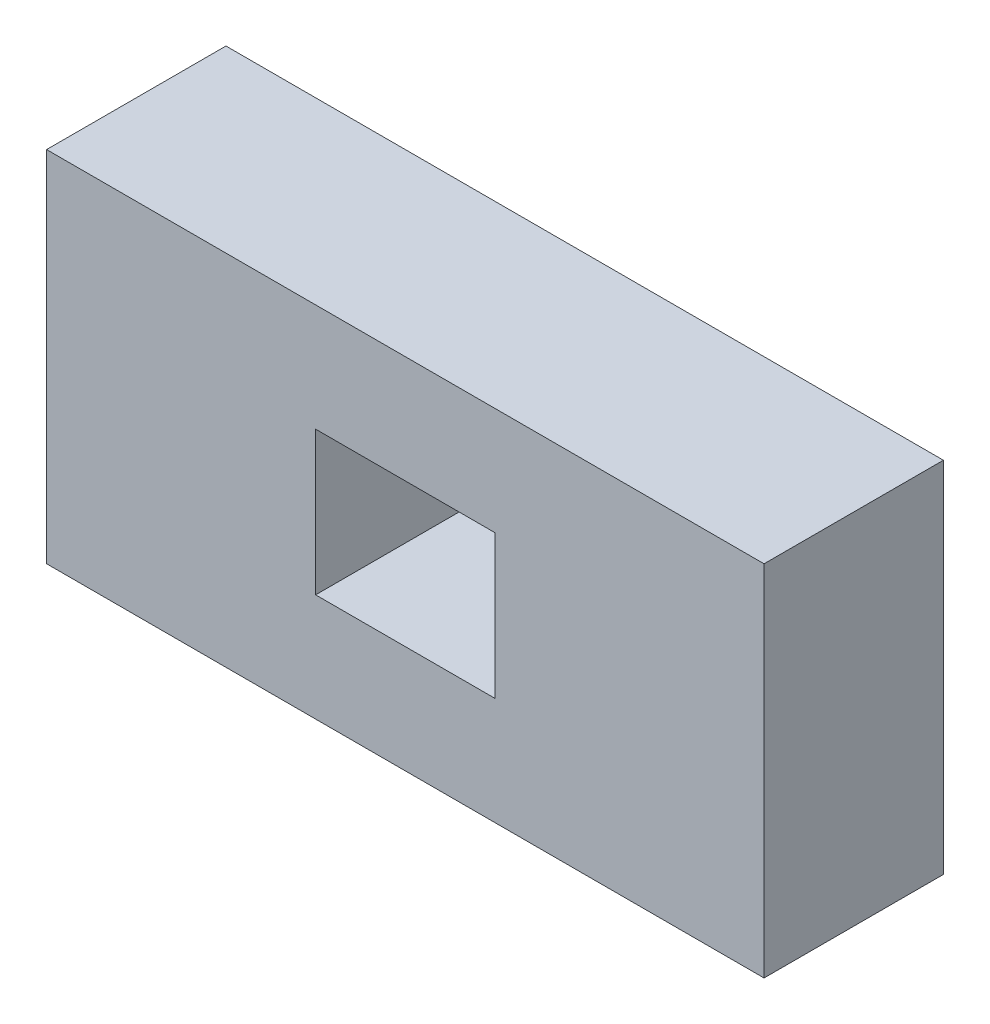
ISO-10303-21;
HEADER;
FILE_DESCRIPTION(('STEP AP214'),'2;1');
FILE_NAME('part.step','',(''),(''),'','','');
FILE_SCHEMA(('AUTOMOTIVE_DESIGN { 1 0 10303 214 1 1 1 1 }'));
ENDSEC;
DATA;
#1=APPLICATION_CONTEXT('core data for automotive mechanical design processes');
#2=APPLICATION_PROTOCOL_DEFINITION('international standard','automotive_design',2000,#1);
#3=PRODUCT_CONTEXT('',#1,'mechanical');
#4=PRODUCT('Part','Part','',(#3));
#5=PRODUCT_RELATED_PRODUCT_CATEGORY('part','',(#4));
#6=PRODUCT_DEFINITION_FORMATION('','',#4);
#7=PRODUCT_DEFINITION_CONTEXT('part definition',#1,'design');
#8=PRODUCT_DEFINITION('design','',#6,#7);
#9=PRODUCT_DEFINITION_SHAPE('','',#8);
#10=(LENGTH_UNIT() NAMED_UNIT(*) SI_UNIT(.MILLI.,.METRE.));
#11=(NAMED_UNIT(*) PLANE_ANGLE_UNIT() SI_UNIT($,.RADIAN.));
#12=(NAMED_UNIT(*) SI_UNIT($,.STERADIAN.) SOLID_ANGLE_UNIT());
#13=UNCERTAINTY_MEASURE_WITH_UNIT(LENGTH_MEASURE(1.E-05),#10,'distance_accuracy_value','');
#14=(GEOMETRIC_REPRESENTATION_CONTEXT(3) GLOBAL_UNCERTAINTY_ASSIGNED_CONTEXT((#13)) GLOBAL_UNIT_ASSIGNED_CONTEXT((#10,
#11,#12)) REPRESENTATION_CONTEXT('',''));
#15=CARTESIAN_POINT('',(0.,0.,0.));
#16=DIRECTION('',(0.,0.,1.));
#17=DIRECTION('',(1.,0.,0.));
#18=AXIS2_PLACEMENT_3D('',#15,#16,#17);
#19=CARTESIAN_POINT('',(0.,0.,10.));
#20=DIRECTION('',(1.,0.,0.));
#21=DIRECTION('',(0.,0.,-1.));
#22=AXIS2_PLACEMENT_3D('',#19,#20,#21);
#23=PLANE('',#22);
#24=DIRECTION('',(0.,-1.,0.));
#25=VECTOR('',#24,1.);
#26=CARTESIAN_POINT('',(0.,0.,0.));
#27=LINE('',#26,#25);
#28=CARTESIAN_POINT('',(0.,20.,0.));
#29=VERTEX_POINT('',#28);
#30=CARTESIAN_POINT('',(0.,0.,0.));
#31=VERTEX_POINT('',#30);
#32=EDGE_CURVE('E142',#29,#31,#27,.T.);
#33=ORIENTED_EDGE('',*,*,#32,.T.);
#34=DIRECTION('',(0.,0.,-1.));
#35=VECTOR('',#34,1.);
#36=CARTESIAN_POINT('',(0.,0.,10.));
#37=LINE('',#36,#35);
#38=CARTESIAN_POINT('',(0.,0.,10.));
#39=VERTEX_POINT('',#38);
#40=EDGE_CURVE('E11',#39,#31,#37,.T.);
#41=ORIENTED_EDGE('',*,*,#40,.F.);
#42=DIRECTION('',(0.,-1.,0.));
#43=VECTOR('',#42,1.);
#44=CARTESIAN_POINT('',(0.,0.,10.));
#45=LINE('',#44,#43);
#46=CARTESIAN_POINT('',(0.,20.,10.));
#47=VERTEX_POINT('',#46);
#48=EDGE_CURVE('E148',#47,#39,#45,.T.);
#49=ORIENTED_EDGE('',*,*,#48,.F.);
#50=DIRECTION('',(0.,0.,-1.));
#51=VECTOR('',#50,1.);
#52=CARTESIAN_POINT('',(0.,20.,10.));
#53=LINE('',#52,#51);
#54=EDGE_CURVE('E156',#47,#29,#53,.T.);
#55=ORIENTED_EDGE('',*,*,#54,.T.);
#56=EDGE_LOOP('',(#33,#41,#49,#55));
#57=FACE_BOUND('',#56,.T.);
#58=ADVANCED_FACE('F44',(#57),#23,.F.);
#59=CARTESIAN_POINT('',(0.,0.,10.));
#60=DIRECTION('',(0.,1.,0.));
#61=DIRECTION('',(0.,0.,1.));
#62=AXIS2_PLACEMENT_3D('',#59,#60,#61);
#63=PLANE('',#62);
#64=DIRECTION('',(1.,0.,0.));
#65=VECTOR('',#64,1.);
#66=CARTESIAN_POINT('',(0.,0.,0.));
#67=LINE('',#66,#65);
#68=CARTESIAN_POINT('',(40.,0.,0.));
#69=VERTEX_POINT('',#68);
#70=EDGE_CURVE('E157',#31,#69,#67,.T.);
#71=ORIENTED_EDGE('',*,*,#70,.T.);
#72=DIRECTION('',(0.,0.,-1.));
#73=VECTOR('',#72,1.);
#74=CARTESIAN_POINT('',(40.,0.,10.));
#75=LINE('',#74,#73);
#76=CARTESIAN_POINT('',(40.,0.,10.));
#77=VERTEX_POINT('',#76);
#78=EDGE_CURVE('E55',#77,#69,#75,.T.);
#79=ORIENTED_EDGE('',*,*,#78,.F.);
#80=DIRECTION('',(1.,0.,0.));
#81=VECTOR('',#80,1.);
#82=CARTESIAN_POINT('',(0.,0.,10.));
#83=LINE('',#82,#81);
#84=EDGE_CURVE('E149',#39,#77,#83,.T.);
#85=ORIENTED_EDGE('',*,*,#84,.F.);
#86=ORIENTED_EDGE('',*,*,#40,.T.);
#87=EDGE_LOOP('',(#71,#79,#85,#86));
#88=FACE_BOUND('',#87,.T.);
#89=ADVANCED_FACE('F190',(#88),#63,.F.);
#90=CARTESIAN_POINT('',(40.,0.,10.));
#91=DIRECTION('',(-1.,0.,0.));
#92=DIRECTION('',(0.,0.,1.));
#93=AXIS2_PLACEMENT_3D('',#90,#91,#92);
#94=PLANE('',#93);
#95=DIRECTION('',(0.,1.,0.));
#96=VECTOR('',#95,1.);
#97=CARTESIAN_POINT('',(40.,0.,0.));
#98=LINE('',#97,#96);
#99=CARTESIAN_POINT('',(40.,20.,0.));
#100=VERTEX_POINT('',#99);
#101=EDGE_CURVE('E161',#69,#100,#98,.T.);
#102=ORIENTED_EDGE('',*,*,#101,.T.);
#103=DIRECTION('',(0.,0.,-1.));
#104=VECTOR('',#103,1.);
#105=CARTESIAN_POINT('',(40.,20.,10.));
#106=LINE('',#105,#104);
#107=CARTESIAN_POINT('',(40.,20.,10.));
#108=VERTEX_POINT('',#107);
#109=EDGE_CURVE('E167',#108,#100,#106,.T.);
#110=ORIENTED_EDGE('',*,*,#109,.F.);
#111=DIRECTION('',(0.,1.,0.));
#112=VECTOR('',#111,1.);
#113=CARTESIAN_POINT('',(40.,0.,10.));
#114=LINE('',#113,#112);
#115=EDGE_CURVE('E155',#77,#108,#114,.T.);
#116=ORIENTED_EDGE('',*,*,#115,.F.);
#117=ORIENTED_EDGE('',*,*,#78,.T.);
#118=EDGE_LOOP('',(#102,#110,#116,#117));
#119=FACE_BOUND('',#118,.T.);
#120=ADVANCED_FACE('F174',(#119),#94,.F.);
#121=CARTESIAN_POINT('',(0.,20.,10.));
#122=DIRECTION('',(0.,-1.,0.));
#123=DIRECTION('',(0.,0.,-1.));
#124=AXIS2_PLACEMENT_3D('',#121,#122,#123);
#125=PLANE('',#124);
#126=DIRECTION('',(-1.,0.,0.));
#127=VECTOR('',#126,1.);
#128=CARTESIAN_POINT('',(0.,20.,0.));
#129=LINE('',#128,#127);
#130=EDGE_CURVE('E147',#100,#29,#129,.T.);
#131=ORIENTED_EDGE('',*,*,#130,.T.);
#132=ORIENTED_EDGE('',*,*,#54,.F.);
#133=DIRECTION('',(-1.,0.,0.));
#134=VECTOR('',#133,1.);
#135=CARTESIAN_POINT('',(0.,20.,10.));
#136=LINE('',#135,#134);
#137=EDGE_CURVE('E152',#108,#47,#136,.T.);
#138=ORIENTED_EDGE('',*,*,#137,.F.);
#139=ORIENTED_EDGE('',*,*,#109,.T.);
#140=EDGE_LOOP('',(#131,#132,#138,#139));
#141=FACE_BOUND('',#140,.T.);
#142=ADVANCED_FACE('F180',(#141),#125,.F.);
#143=CARTESIAN_POINT('',(0.,0.,10.));
#144=DIRECTION('',(0.,0.,-1.));
#145=DIRECTION('',(-1.,0.,0.));
#146=AXIS2_PLACEMENT_3D('',#143,#144,#145);
#147=PLANE('',#146);
#148=DIRECTION('',(1.,0.,0.));
#149=VECTOR('',#148,1.);
#150=CARTESIAN_POINT('',(15.,6.,10.));
#151=LINE('',#150,#149);
#152=CARTESIAN_POINT('',(15.,6.,10.));
#153=VERTEX_POINT('',#152);
#154=CARTESIAN_POINT('',(25.,6.,10.));
#155=VERTEX_POINT('',#154);
#156=EDGE_CURVE('E136',#153,#155,#151,.T.);
#157=ORIENTED_EDGE('',*,*,#156,.F.);
#158=DIRECTION('',(0.,-1.,0.));
#159=VECTOR('',#158,1.);
#160=CARTESIAN_POINT('',(15.,6.,10.));
#161=LINE('',#160,#159);
#162=CARTESIAN_POINT('',(15.,14.,10.));
#163=VERTEX_POINT('',#162);
#164=EDGE_CURVE('E56',#163,#153,#161,.T.);
#165=ORIENTED_EDGE('',*,*,#164,.F.);
#166=DIRECTION('',(-1.,0.,0.));
#167=VECTOR('',#166,1.);
#168=CARTESIAN_POINT('',(15.,14.,10.));
#169=LINE('',#168,#167);
#170=CARTESIAN_POINT('',(25.,14.,10.));
#171=VERTEX_POINT('',#170);
#172=EDGE_CURVE('E130',#171,#163,#169,.T.);
#173=ORIENTED_EDGE('',*,*,#172,.F.);
#174=DIRECTION('',(0.,1.,0.));
#175=VECTOR('',#174,1.);
#176=CARTESIAN_POINT('',(25.,6.,10.));
#177=LINE('',#176,#175);
#178=EDGE_CURVE('E128',#155,#171,#177,.T.);
#179=ORIENTED_EDGE('',*,*,#178,.F.);
#180=EDGE_LOOP('',(#157,#165,#173,#179));
#181=FACE_BOUND('',#180,.T.);
#182=ORIENTED_EDGE('',*,*,#48,.T.);
#183=ORIENTED_EDGE('',*,*,#84,.T.);
#184=ORIENTED_EDGE('',*,*,#115,.T.);
#185=ORIENTED_EDGE('',*,*,#137,.T.);
#186=EDGE_LOOP('',(#182,#183,#184,#185));
#187=FACE_BOUND('',#186,.T.);
#188=ADVANCED_FACE('F187',(#181,#187),#147,.F.);
#189=CARTESIAN_POINT('',(0.,0.,0.));
#190=DIRECTION('',(0.,0.,-1.));
#191=DIRECTION('',(-1.,0.,0.));
#192=AXIS2_PLACEMENT_3D('',#189,#190,#191);
#193=PLANE('',#192);
#194=DIRECTION('',(0.,-1.,0.));
#195=VECTOR('',#194,1.);
#196=CARTESIAN_POINT('',(15.,6.,0.));
#197=LINE('',#196,#195);
#198=CARTESIAN_POINT('',(15.,14.,0.));
#199=VERTEX_POINT('',#198);
#200=CARTESIAN_POINT('',(15.,6.,0.));
#201=VERTEX_POINT('',#200);
#202=EDGE_CURVE('E112',#199,#201,#197,.T.);
#203=ORIENTED_EDGE('',*,*,#202,.T.);
#204=DIRECTION('',(1.,0.,0.));
#205=VECTOR('',#204,1.);
#206=CARTESIAN_POINT('',(15.,6.,0.));
#207=LINE('',#206,#205);
#208=CARTESIAN_POINT('',(25.,6.,0.));
#209=VERTEX_POINT('',#208);
#210=EDGE_CURVE('E118',#201,#209,#207,.T.);
#211=ORIENTED_EDGE('',*,*,#210,.T.);
#212=DIRECTION('',(0.,1.,0.));
#213=VECTOR('',#212,1.);
#214=CARTESIAN_POINT('',(25.,6.,0.));
#215=LINE('',#214,#213);
#216=CARTESIAN_POINT('',(25.,14.,0.));
#217=VERTEX_POINT('',#216);
#218=EDGE_CURVE('E67',#209,#217,#215,.T.);
#219=ORIENTED_EDGE('',*,*,#218,.T.);
#220=DIRECTION('',(-1.,0.,0.));
#221=VECTOR('',#220,1.);
#222=CARTESIAN_POINT('',(15.,14.,0.));
#223=LINE('',#222,#221);
#224=EDGE_CURVE('E120',#217,#199,#223,.T.);
#225=ORIENTED_EDGE('',*,*,#224,.T.);
#226=EDGE_LOOP('',(#203,#211,#219,#225));
#227=FACE_BOUND('',#226,.T.);
#228=ORIENTED_EDGE('',*,*,#32,.F.);
#229=ORIENTED_EDGE('',*,*,#130,.F.);
#230=ORIENTED_EDGE('',*,*,#101,.F.);
#231=ORIENTED_EDGE('',*,*,#70,.F.);
#232=EDGE_LOOP('',(#228,#229,#230,#231));
#233=FACE_BOUND('',#232,.T.);
#234=ADVANCED_FACE('F123',(#227,#233),#193,.T.);
#235=CARTESIAN_POINT('',(15.,6.,0.));
#236=DIRECTION('',(-1.,0.,0.));
#237=DIRECTION('',(0.,0.,1.));
#238=AXIS2_PLACEMENT_3D('',#235,#236,#237);
#239=PLANE('',#238);
#240=ORIENTED_EDGE('',*,*,#164,.T.);
#241=DIRECTION('',(0.,0.,1.));
#242=VECTOR('',#241,1.);
#243=CARTESIAN_POINT('',(15.,6.,0.));
#244=LINE('',#243,#242);
#245=EDGE_CURVE('E110',#201,#153,#244,.T.);
#246=ORIENTED_EDGE('',*,*,#245,.F.);
#247=ORIENTED_EDGE('',*,*,#202,.F.);
#248=DIRECTION('',(0.,0.,1.));
#249=VECTOR('',#248,1.);
#250=CARTESIAN_POINT('',(15.,14.,0.));
#251=LINE('',#250,#249);
#252=EDGE_CURVE('E140',#199,#163,#251,.T.);
#253=ORIENTED_EDGE('',*,*,#252,.T.);
#254=EDGE_LOOP('',(#240,#246,#247,#253));
#255=FACE_BOUND('',#254,.T.);
#256=ADVANCED_FACE('F108',(#255),#239,.F.);
#257=CARTESIAN_POINT('',(15.,14.,0.));
#258=DIRECTION('',(0.,1.,0.));
#259=DIRECTION('',(0.,0.,1.));
#260=AXIS2_PLACEMENT_3D('',#257,#258,#259);
#261=PLANE('',#260);
#262=ORIENTED_EDGE('',*,*,#172,.T.);
#263=ORIENTED_EDGE('',*,*,#252,.F.);
#264=ORIENTED_EDGE('',*,*,#224,.F.);
#265=DIRECTION('',(0.,0.,1.));
#266=VECTOR('',#265,1.);
#267=CARTESIAN_POINT('',(25.,14.,0.));
#268=LINE('',#267,#266);
#269=EDGE_CURVE('E141',#217,#171,#268,.T.);
#270=ORIENTED_EDGE('',*,*,#269,.T.);
#271=EDGE_LOOP('',(#262,#263,#264,#270));
#272=FACE_BOUND('',#271,.T.);
#273=ADVANCED_FACE('F204',(#272),#261,.F.);
#274=CARTESIAN_POINT('',(25.,6.,0.));
#275=DIRECTION('',(1.,0.,0.));
#276=DIRECTION('',(0.,0.,-1.));
#277=AXIS2_PLACEMENT_3D('',#274,#275,#276);
#278=PLANE('',#277);
#279=ORIENTED_EDGE('',*,*,#178,.T.);
#280=ORIENTED_EDGE('',*,*,#269,.F.);
#281=ORIENTED_EDGE('',*,*,#218,.F.);
#282=DIRECTION('',(0.,0.,1.));
#283=VECTOR('',#282,1.);
#284=CARTESIAN_POINT('',(25.,6.,0.));
#285=LINE('',#284,#283);
#286=EDGE_CURVE('E117',#209,#155,#285,.T.);
#287=ORIENTED_EDGE('',*,*,#286,.T.);
#288=EDGE_LOOP('',(#279,#280,#281,#287));
#289=FACE_BOUND('',#288,.T.);
#290=ADVANCED_FACE('F210',(#289),#278,.F.);
#291=CARTESIAN_POINT('',(15.,6.,0.));
#292=DIRECTION('',(0.,-1.,0.));
#293=DIRECTION('',(0.,0.,-1.));
#294=AXIS2_PLACEMENT_3D('',#291,#292,#293);
#295=PLANE('',#294);
#296=ORIENTED_EDGE('',*,*,#156,.T.);
#297=ORIENTED_EDGE('',*,*,#286,.F.);
#298=ORIENTED_EDGE('',*,*,#210,.F.);
#299=ORIENTED_EDGE('',*,*,#245,.T.);
#300=EDGE_LOOP('',(#296,#297,#298,#299));
#301=FACE_BOUND('',#300,.T.);
#302=ADVANCED_FACE('F121',(#301),#295,.F.);
#303=CLOSED_SHELL('',(#58,#89,#120,#142,#188,#234,#256,#273,#290,#302));
#304=MANIFOLD_SOLID_BREP('B2',#303);
#305=ADVANCED_BREP_SHAPE_REPRESENTATION('',(#18,#304),#14);
#306=SHAPE_DEFINITION_REPRESENTATION(#9,#305);
ENDSEC;
END-ISO-10303-21;
